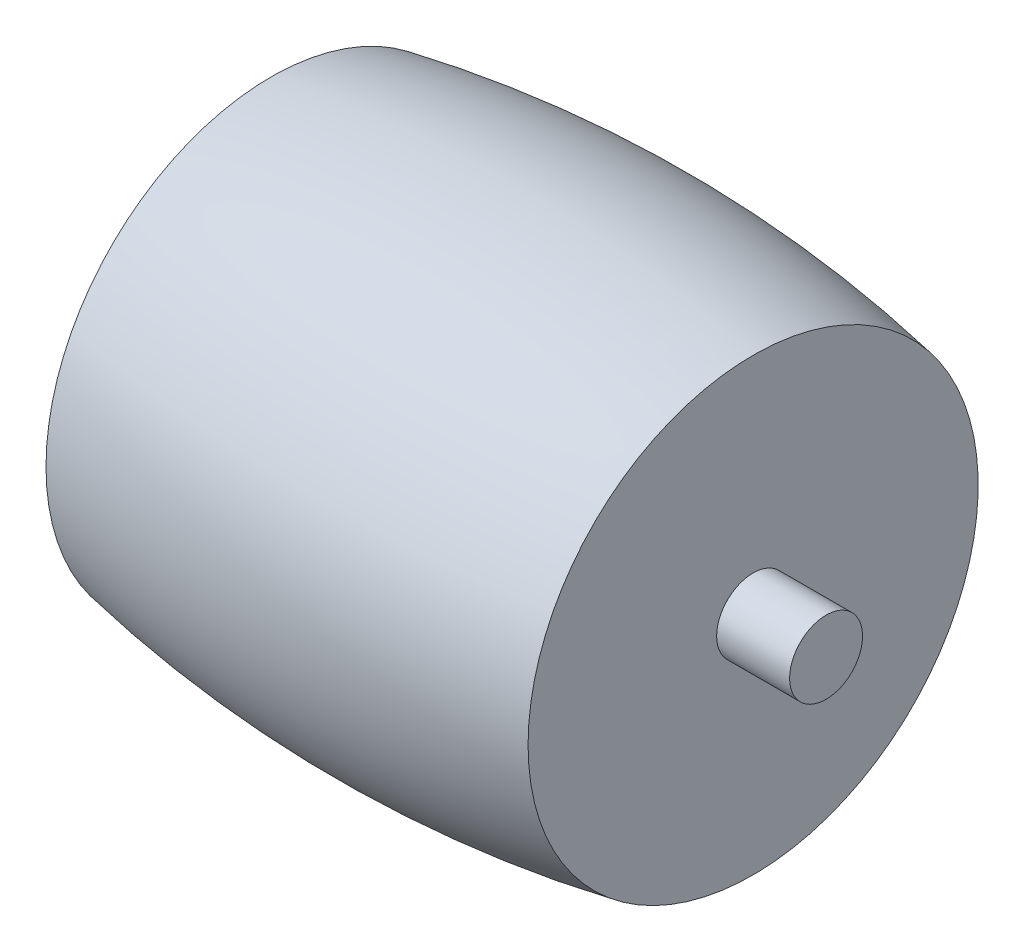
ISO-10303-21;
HEADER;
FILE_DESCRIPTION(('STEP AP214'),'2;1');
FILE_NAME('part.step','',(''),(''),'','','');
FILE_SCHEMA(('AUTOMOTIVE_DESIGN { 1 0 10303 214 1 1 1 1 }'));
ENDSEC;
DATA;
#1=APPLICATION_CONTEXT('core data for automotive mechanical design processes');
#2=APPLICATION_PROTOCOL_DEFINITION('international standard','automotive_design',2000,#1);
#3=PRODUCT_CONTEXT('',#1,'mechanical');
#4=PRODUCT('Part','Part','',(#3));
#5=PRODUCT_RELATED_PRODUCT_CATEGORY('part','',(#4));
#6=PRODUCT_DEFINITION_FORMATION('','',#4);
#7=PRODUCT_DEFINITION_CONTEXT('part definition',#1,'design');
#8=PRODUCT_DEFINITION('design','',#6,#7);
#9=PRODUCT_DEFINITION_SHAPE('','',#8);
#10=(LENGTH_UNIT() NAMED_UNIT(*) SI_UNIT(.MILLI.,.METRE.));
#11=(NAMED_UNIT(*) PLANE_ANGLE_UNIT() SI_UNIT($,.RADIAN.));
#12=(NAMED_UNIT(*) SI_UNIT($,.STERADIAN.) SOLID_ANGLE_UNIT());
#13=UNCERTAINTY_MEASURE_WITH_UNIT(LENGTH_MEASURE(1.E-05),#10,'distance_accuracy_value','');
#14=(GEOMETRIC_REPRESENTATION_CONTEXT(3) GLOBAL_UNCERTAINTY_ASSIGNED_CONTEXT((#13)) GLOBAL_UNIT_ASSIGNED_CONTEXT((#10,
#11,#12)) REPRESENTATION_CONTEXT('',''));
#15=CARTESIAN_POINT('',(0.,0.,0.));
#16=DIRECTION('',(0.,0.,1.));
#17=DIRECTION('',(1.,0.,0.));
#18=AXIS2_PLACEMENT_3D('',#15,#16,#17);
#19=CARTESIAN_POINT('',(-9.24999999999999,40.5,0.));
#20=DIRECTION('',(-1.,0.,0.));
#21=DIRECTION('',(0.,0.,1.));
#22=AXIS2_PLACEMENT_3D('',#19,#20,#21);
#23=CYLINDRICAL_SURFACE('',#22,1.39999999999998);
#24=CARTESIAN_POINT('',(9.24999999999999,40.5,0.));
#25=DIRECTION('',(-1.,0.,0.));
#26=DIRECTION('',(0.,0.,1.));
#27=AXIS2_PLACEMENT_3D('',#24,#25,#26);
#28=CIRCLE('',#27,1.39999999999998);
#29=CARTESIAN_POINT('',(9.24999999999999,40.5,1.39999999999998));
#30=VERTEX_POINT('',#29);
#31=EDGE_CURVE('E10',#30,#30,#28,.T.);
#32=ORIENTED_EDGE('',*,*,#31,.F.);
#33=EDGE_LOOP('',(#32));
#34=FACE_BOUND('',#33,.T.);
#35=CARTESIAN_POINT('',(12.05,40.5,0.));
#36=DIRECTION('',(-1.,0.,0.));
#37=DIRECTION('',(0.,0.,1.));
#38=AXIS2_PLACEMENT_3D('',#35,#36,#37);
#39=CIRCLE('',#38,1.39999999999998);
#40=CARTESIAN_POINT('',(12.05,40.5,1.39999999999998));
#41=VERTEX_POINT('',#40);
#42=EDGE_CURVE('E55',#41,#41,#39,.T.);
#43=ORIENTED_EDGE('',*,*,#42,.T.);
#44=EDGE_LOOP('',(#43));
#45=FACE_BOUND('',#44,.T.);
#46=ADVANCED_FACE('F33',(#34,#45),#23,.T.);
#47=CARTESIAN_POINT('',(9.25,49.1369260332797,0.));
#48=DIRECTION('',(-1.,0.,0.));
#49=DIRECTION('',(0.,0.,1.));
#50=AXIS2_PLACEMENT_3D('',#47,#48,#49);
#51=PLANE('',#50);
#52=CARTESIAN_POINT('',(9.25000000000001,40.5,0.));
#53=DIRECTION('',(-1.,0.,0.));
#54=DIRECTION('',(0.,0.,1.));
#55=AXIS2_PLACEMENT_3D('',#52,#53,#54);
#56=CIRCLE('',#55,8.63692603327968);
#57=CARTESIAN_POINT('',(9.25000000000001,40.5,8.63692603327968));
#58=VERTEX_POINT('',#57);
#59=EDGE_CURVE('E39',#58,#58,#56,.T.);
#60=ORIENTED_EDGE('',*,*,#59,.F.);
#61=EDGE_LOOP('',(#60));
#62=FACE_BOUND('',#61,.T.);
#63=ORIENTED_EDGE('',*,*,#31,.T.);
#64=EDGE_LOOP('',(#63));
#65=FACE_BOUND('',#64,.T.);
#66=ADVANCED_FACE('F71',(#62,#65),#51,.F.);
#67=CARTESIAN_POINT('',(0.,40.5,0.));
#68=DIRECTION('',(-1.,0.,0.));
#69=DIRECTION('',(0.,0.,1.));
#70=AXIS2_PLACEMENT_3D('',#67,#68,#69);
#71=DEGENERATE_TOROIDAL_SURFACE('',#70,40.5,50.,.F.);
#72=CARTESIAN_POINT('',(-9.25000000000001,40.5,0.));
#73=DIRECTION('',(-1.,0.,0.));
#74=DIRECTION('',(0.,0.,1.));
#75=AXIS2_PLACEMENT_3D('',#72,#73,#74);
#76=CIRCLE('',#75,8.63692603327969);
#77=CARTESIAN_POINT('',(-9.25000000000001,40.5,8.63692603327969));
#78=VERTEX_POINT('',#77);
#79=EDGE_CURVE('E43',#78,#78,#76,.T.);
#80=ORIENTED_EDGE('',*,*,#79,.F.);
#81=EDGE_LOOP('',(#80));
#82=FACE_BOUND('',#81,.T.);
#83=ORIENTED_EDGE('',*,*,#59,.T.);
#84=EDGE_LOOP('',(#83));
#85=FACE_BOUND('',#84,.T.);
#86=ADVANCED_FACE('F76',(#82,#85),#71,.F.);
#87=CARTESIAN_POINT('',(-9.25000000000001,49.1369260332797,0.));
#88=DIRECTION('',(1.,0.,0.));
#89=DIRECTION('',(0.,0.,-1.));
#90=AXIS2_PLACEMENT_3D('',#87,#88,#89);
#91=PLANE('',#90);
#92=CARTESIAN_POINT('',(-9.25,40.5,0.));
#93=DIRECTION('',(-1.,0.,0.));
#94=DIRECTION('',(0.,0.,1.));
#95=AXIS2_PLACEMENT_3D('',#92,#93,#94);
#96=CIRCLE('',#95,1.39999999999998);
#97=CARTESIAN_POINT('',(-9.25,40.5,1.39999999999998));
#98=VERTEX_POINT('',#97);
#99=EDGE_CURVE('E47',#98,#98,#96,.T.);
#100=ORIENTED_EDGE('',*,*,#99,.F.);
#101=EDGE_LOOP('',(#100));
#102=FACE_BOUND('',#101,.T.);
#103=ORIENTED_EDGE('',*,*,#79,.T.);
#104=EDGE_LOOP('',(#103));
#105=FACE_BOUND('',#104,.T.);
#106=ADVANCED_FACE('F81',(#102,#105),#91,.F.);
#107=CARTESIAN_POINT('',(-9.24999999999999,40.5,0.));
#108=DIRECTION('',(-1.,0.,0.));
#109=DIRECTION('',(0.,0.,1.));
#110=AXIS2_PLACEMENT_3D('',#107,#108,#109);
#111=CYLINDRICAL_SURFACE('',#110,1.39999999999998);
#112=CARTESIAN_POINT('',(-12.05,40.5,0.));
#113=DIRECTION('',(-1.,0.,0.));
#114=DIRECTION('',(0.,0.,1.));
#115=AXIS2_PLACEMENT_3D('',#112,#113,#114);
#116=CIRCLE('',#115,1.39999999999998);
#117=CARTESIAN_POINT('',(-12.05,40.5,1.39999999999998));
#118=VERTEX_POINT('',#117);
#119=EDGE_CURVE('E52',#118,#118,#116,.T.);
#120=ORIENTED_EDGE('',*,*,#119,.F.);
#121=EDGE_LOOP('',(#120));
#122=FACE_BOUND('',#121,.T.);
#123=ORIENTED_EDGE('',*,*,#99,.T.);
#124=EDGE_LOOP('',(#123));
#125=FACE_BOUND('',#124,.T.);
#126=ADVANCED_FACE('F67',(#122,#125),#111,.T.);
#127=CARTESIAN_POINT('',(-12.05,41.9,0.));
#128=DIRECTION('',(1.,0.,0.));
#129=DIRECTION('',(0.,0.,-1.));
#130=AXIS2_PLACEMENT_3D('',#127,#128,#129);
#131=PLANE('',#130);
#132=ORIENTED_EDGE('',*,*,#119,.T.);
#133=EDGE_LOOP('',(#132));
#134=FACE_BOUND('',#133,.T.);
#135=ADVANCED_FACE('F62',(#134),#131,.F.);
#136=CARTESIAN_POINT('',(12.05,41.9,0.));
#137=DIRECTION('',(-1.,0.,0.));
#138=DIRECTION('',(0.,0.,1.));
#139=AXIS2_PLACEMENT_3D('',#136,#137,#138);
#140=PLANE('',#139);
#141=ORIENTED_EDGE('',*,*,#42,.F.);
#142=EDGE_LOOP('',(#141));
#143=FACE_BOUND('',#142,.T.);
#144=ADVANCED_FACE('F60',(#143),#140,.F.);
#145=CLOSED_SHELL('',(#46,#66,#86,#106,#126,#135,#144));
#146=MANIFOLD_SOLID_BREP('B2',#145);
#147=ADVANCED_BREP_SHAPE_REPRESENTATION('',(#18,#146),#14);
#148=SHAPE_DEFINITION_REPRESENTATION(#9,#147);
ENDSEC;
END-ISO-10303-21;
